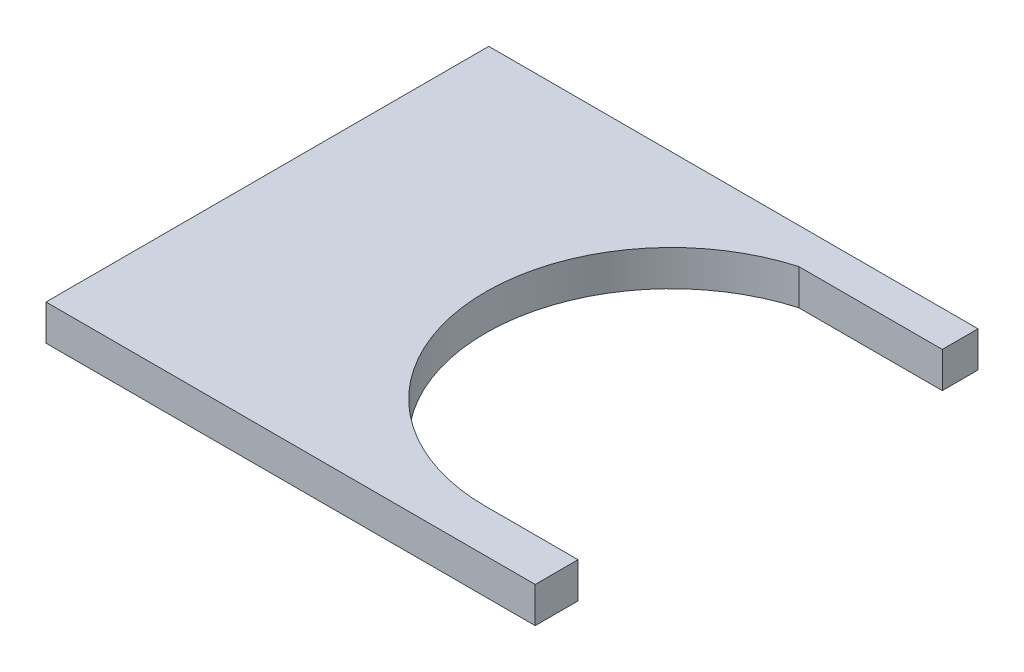
ISO-10303-21;
HEADER;
FILE_DESCRIPTION(('STEP AP214'),'2;1');
FILE_NAME('part.step','',(''),(''),'','','');
FILE_SCHEMA(('AUTOMOTIVE_DESIGN { 1 0 10303 214 1 1 1 1 }'));
ENDSEC;
DATA;
#1=APPLICATION_CONTEXT('core data for automotive mechanical design processes');
#2=APPLICATION_PROTOCOL_DEFINITION('international standard','automotive_design',2000,#1);
#3=PRODUCT_CONTEXT('',#1,'mechanical');
#4=PRODUCT('Part','Part','',(#3));
#5=PRODUCT_RELATED_PRODUCT_CATEGORY('part','',(#4));
#6=PRODUCT_DEFINITION_FORMATION('','',#4);
#7=PRODUCT_DEFINITION_CONTEXT('part definition',#1,'design');
#8=PRODUCT_DEFINITION('design','',#6,#7);
#9=PRODUCT_DEFINITION_SHAPE('','',#8);
#10=(LENGTH_UNIT() NAMED_UNIT(*) SI_UNIT(.MILLI.,.METRE.));
#11=(NAMED_UNIT(*) PLANE_ANGLE_UNIT() SI_UNIT($,.RADIAN.));
#12=(NAMED_UNIT(*) SI_UNIT($,.STERADIAN.) SOLID_ANGLE_UNIT());
#13=UNCERTAINTY_MEASURE_WITH_UNIT(LENGTH_MEASURE(1.E-05),#10,'distance_accuracy_value','');
#14=(GEOMETRIC_REPRESENTATION_CONTEXT(3) GLOBAL_UNCERTAINTY_ASSIGNED_CONTEXT((#13)) GLOBAL_UNIT_ASSIGNED_CONTEXT((#10,
#11,#12)) REPRESENTATION_CONTEXT('',''));
#15=CARTESIAN_POINT('',(0.,0.,0.));
#16=DIRECTION('',(0.,0.,1.));
#17=DIRECTION('',(1.,0.,0.));
#18=AXIS2_PLACEMENT_3D('',#15,#16,#17);
#19=CARTESIAN_POINT('',(111.1,10.,-64.));
#20=DIRECTION('',(0.,-1.,0.));
#21=DIRECTION('',(0.,0.,-1.));
#22=AXIS2_PLACEMENT_3D('',#19,#20,#21);
#23=CYLINDRICAL_SURFACE('',#22,52.);
#24=CARTESIAN_POINT('',(111.1,0.,-64.));
#25=DIRECTION('',(0.,-1.,0.));
#26=DIRECTION('',(0.,0.,1.));
#27=AXIS2_PLACEMENT_3D('',#24,#25,#26);
#28=CIRCLE('',#27,52.);
#29=CARTESIAN_POINT('',(111.1,0.,-12.));
#30=VERTEX_POINT('',#29);
#31=CARTESIAN_POINT('',(96.8171431429143,0.,-114.));
#32=VERTEX_POINT('',#31);
#33=EDGE_CURVE('E55',#30,#32,#28,.T.);
#34=ORIENTED_EDGE('',*,*,#33,.T.);
#35=DIRECTION('',(0.,1.,0.));
#36=VECTOR('',#35,1.);
#37=CARTESIAN_POINT('',(96.8171431429143,-41.4084772141773,-114.));
#38=LINE('',#37,#36);
#39=CARTESIAN_POINT('',(96.8171431429143,10.,-114.));
#40=VERTEX_POINT('',#39);
#41=EDGE_CURVE('E50',#32,#40,#38,.T.);
#42=ORIENTED_EDGE('',*,*,#41,.T.);
#43=CARTESIAN_POINT('',(111.1,10.,-64.));
#44=DIRECTION('',(0.,-1.,0.));
#45=DIRECTION('',(0.,0.,1.));
#46=AXIS2_PLACEMENT_3D('',#43,#44,#45);
#47=CIRCLE('',#46,52.);
#48=CARTESIAN_POINT('',(111.1,10.,-12.));
#49=VERTEX_POINT('',#48);
#50=EDGE_CURVE('E109',#49,#40,#47,.T.);
#51=ORIENTED_EDGE('',*,*,#50,.F.);
#52=DIRECTION('',(0.,-1.,0.));
#53=VECTOR('',#52,1.);
#54=CARTESIAN_POINT('',(111.1,10.,-12.));
#55=LINE('',#54,#53);
#56=EDGE_CURVE('E134',#49,#30,#55,.T.);
#57=ORIENTED_EDGE('',*,*,#56,.T.);
#58=EDGE_LOOP('',(#34,#42,#51,#57));
#59=FACE_BOUND('',#58,.T.);
#60=ADVANCED_FACE('F36',(#59),#23,.F.);
#61=CARTESIAN_POINT('',(137.,10.,-116.));
#62=DIRECTION('',(-1.,0.,0.));
#63=DIRECTION('',(0.,0.,1.));
#64=AXIS2_PLACEMENT_3D('',#61,#62,#63);
#65=PLANE('',#64);
#66=DIRECTION('',(0.,0.,-1.));
#67=VECTOR('',#66,1.);
#68=CARTESIAN_POINT('',(137.,0.,-116.));
#69=LINE('',#68,#67);
#70=CARTESIAN_POINT('',(137.,0.,-114.));
#71=VERTEX_POINT('',#70);
#72=CARTESIAN_POINT('',(137.,0.,-124.));
#73=VERTEX_POINT('',#72);
#74=EDGE_CURVE('E136',#71,#73,#69,.T.);
#75=ORIENTED_EDGE('',*,*,#74,.T.);
#76=DIRECTION('',(0.,-1.,0.));
#77=VECTOR('',#76,1.);
#78=CARTESIAN_POINT('',(137.,10.,-124.));
#79=LINE('',#78,#77);
#80=CARTESIAN_POINT('',(137.,10.,-124.));
#81=VERTEX_POINT('',#80);
#82=EDGE_CURVE('E11',#81,#73,#79,.T.);
#83=ORIENTED_EDGE('',*,*,#82,.F.);
#84=DIRECTION('',(0.,0.,-1.));
#85=VECTOR('',#84,1.);
#86=CARTESIAN_POINT('',(137.,10.,-116.));
#87=LINE('',#86,#85);
#88=CARTESIAN_POINT('',(137.,10.,-114.));
#89=VERTEX_POINT('',#88);
#90=EDGE_CURVE('E101',#89,#81,#87,.T.);
#91=ORIENTED_EDGE('',*,*,#90,.F.);
#92=DIRECTION('',(0.,1.,0.));
#93=VECTOR('',#92,1.);
#94=CARTESIAN_POINT('',(137.,-41.4084772141773,-114.));
#95=LINE('',#94,#93);
#96=EDGE_CURVE('E104',#71,#89,#95,.T.);
#97=ORIENTED_EDGE('',*,*,#96,.F.);
#98=EDGE_LOOP('',(#75,#83,#91,#97));
#99=FACE_BOUND('',#98,.T.);
#100=ADVANCED_FACE('F103',(#99),#65,.F.);
#101=CARTESIAN_POINT('',(137.,10.,-124.));
#102=DIRECTION('',(0.,0.,1.));
#103=DIRECTION('',(1.,0.,0.));
#104=AXIS2_PLACEMENT_3D('',#101,#102,#103);
#105=PLANE('',#104);
#106=DIRECTION('',(0.,-1.,0.));
#107=VECTOR('',#106,1.);
#108=CARTESIAN_POINT('',(0.,10.,-124.));
#109=LINE('',#108,#107);
#110=CARTESIAN_POINT('',(0.,10.,-124.));
#111=VERTEX_POINT('',#110);
#112=CARTESIAN_POINT('',(0.,0.,-124.));
#113=VERTEX_POINT('',#112);
#114=EDGE_CURVE('E43',#111,#113,#109,.T.);
#115=ORIENTED_EDGE('',*,*,#114,.F.);
#116=DIRECTION('',(-1.,0.,0.));
#117=VECTOR('',#116,1.);
#118=CARTESIAN_POINT('',(137.,10.,-124.));
#119=LINE('',#118,#117);
#120=EDGE_CURVE('E108',#81,#111,#119,.T.);
#121=ORIENTED_EDGE('',*,*,#120,.F.);
#122=ORIENTED_EDGE('',*,*,#82,.T.);
#123=DIRECTION('',(-1.,0.,0.));
#124=VECTOR('',#123,1.);
#125=CARTESIAN_POINT('',(137.,0.,-124.));
#126=LINE('',#125,#124);
#127=EDGE_CURVE('E138',#73,#113,#126,.T.);
#128=ORIENTED_EDGE('',*,*,#127,.T.);
#129=EDGE_LOOP('',(#115,#121,#122,#128));
#130=FACE_BOUND('',#129,.T.);
#131=ADVANCED_FACE('F180',(#130),#105,.F.);
#132=CARTESIAN_POINT('',(0.,10.,-124.));
#133=DIRECTION('',(1.,0.,0.));
#134=DIRECTION('',(0.,0.,-1.));
#135=AXIS2_PLACEMENT_3D('',#132,#133,#134);
#136=PLANE('',#135);
#137=DIRECTION('',(0.,0.,1.));
#138=VECTOR('',#137,1.);
#139=CARTESIAN_POINT('',(0.,0.,-124.));
#140=LINE('',#139,#138);
#141=CARTESIAN_POINT('',(0.,0.,0.));
#142=VERTEX_POINT('',#141);
#143=EDGE_CURVE('E140',#113,#142,#140,.T.);
#144=ORIENTED_EDGE('',*,*,#143,.T.);
#145=DIRECTION('',(0.,-1.,0.));
#146=VECTOR('',#145,1.);
#147=CARTESIAN_POINT('',(0.,10.,0.));
#148=LINE('',#147,#146);
#149=CARTESIAN_POINT('',(0.,10.,0.));
#150=VERTEX_POINT('',#149);
#151=EDGE_CURVE('E154',#150,#142,#148,.T.);
#152=ORIENTED_EDGE('',*,*,#151,.F.);
#153=DIRECTION('',(0.,0.,1.));
#154=VECTOR('',#153,1.);
#155=CARTESIAN_POINT('',(0.,10.,-124.));
#156=LINE('',#155,#154);
#157=EDGE_CURVE('E126',#111,#150,#156,.T.);
#158=ORIENTED_EDGE('',*,*,#157,.F.);
#159=ORIENTED_EDGE('',*,*,#114,.T.);
#160=EDGE_LOOP('',(#144,#152,#158,#159));
#161=FACE_BOUND('',#160,.T.);
#162=ADVANCED_FACE('F161',(#161),#136,.F.);
#163=CARTESIAN_POINT('',(0.,10.,0.));
#164=DIRECTION('',(0.,0.,-1.));
#165=DIRECTION('',(-1.,0.,0.));
#166=AXIS2_PLACEMENT_3D('',#163,#164,#165);
#167=PLANE('',#166);
#168=DIRECTION('',(1.,0.,0.));
#169=VECTOR('',#168,1.);
#170=CARTESIAN_POINT('',(0.,0.,0.));
#171=LINE('',#170,#169);
#172=CARTESIAN_POINT('',(137.,0.,0.));
#173=VERTEX_POINT('',#172);
#174=EDGE_CURVE('E142',#142,#173,#171,.T.);
#175=ORIENTED_EDGE('',*,*,#174,.T.);
#176=DIRECTION('',(0.,-1.,0.));
#177=VECTOR('',#176,1.);
#178=CARTESIAN_POINT('',(137.,10.,0.));
#179=LINE('',#178,#177);
#180=CARTESIAN_POINT('',(137.,10.,0.));
#181=VERTEX_POINT('',#180);
#182=EDGE_CURVE('E151',#181,#173,#179,.T.);
#183=ORIENTED_EDGE('',*,*,#182,.F.);
#184=DIRECTION('',(1.,0.,0.));
#185=VECTOR('',#184,1.);
#186=CARTESIAN_POINT('',(0.,10.,0.));
#187=LINE('',#186,#185);
#188=EDGE_CURVE('E128',#150,#181,#187,.T.);
#189=ORIENTED_EDGE('',*,*,#188,.F.);
#190=ORIENTED_EDGE('',*,*,#151,.T.);
#191=EDGE_LOOP('',(#175,#183,#189,#190));
#192=FACE_BOUND('',#191,.T.);
#193=ADVANCED_FACE('F172',(#192),#167,.F.);
#194=CARTESIAN_POINT('',(137.,10.,-12.));
#195=DIRECTION('',(-1.,0.,0.));
#196=DIRECTION('',(0.,0.,1.));
#197=AXIS2_PLACEMENT_3D('',#194,#195,#196);
#198=PLANE('',#197);
#199=DIRECTION('',(0.,0.,-1.));
#200=VECTOR('',#199,1.);
#201=CARTESIAN_POINT('',(137.,0.,-12.));
#202=LINE('',#201,#200);
#203=CARTESIAN_POINT('',(137.,0.,-12.));
#204=VERTEX_POINT('',#203);
#205=EDGE_CURVE('E144',#173,#204,#202,.T.);
#206=ORIENTED_EDGE('',*,*,#205,.T.);
#207=DIRECTION('',(0.,-1.,0.));
#208=VECTOR('',#207,1.);
#209=CARTESIAN_POINT('',(137.,10.,-12.));
#210=LINE('',#209,#208);
#211=CARTESIAN_POINT('',(137.,10.,-12.));
#212=VERTEX_POINT('',#211);
#213=EDGE_CURVE('E148',#212,#204,#210,.T.);
#214=ORIENTED_EDGE('',*,*,#213,.F.);
#215=DIRECTION('',(0.,0.,-1.));
#216=VECTOR('',#215,1.);
#217=CARTESIAN_POINT('',(137.,10.,-12.));
#218=LINE('',#217,#216);
#219=EDGE_CURVE('E130',#181,#212,#218,.T.);
#220=ORIENTED_EDGE('',*,*,#219,.F.);
#221=ORIENTED_EDGE('',*,*,#182,.T.);
#222=EDGE_LOOP('',(#206,#214,#220,#221));
#223=FACE_BOUND('',#222,.T.);
#224=ADVANCED_FACE('F176',(#223),#198,.F.);
#225=CARTESIAN_POINT('',(111.1,10.,-12.));
#226=DIRECTION('',(0.,0.,1.));
#227=DIRECTION('',(1.,0.,0.));
#228=AXIS2_PLACEMENT_3D('',#225,#226,#227);
#229=PLANE('',#228);
#230=DIRECTION('',(-1.,0.,0.));
#231=VECTOR('',#230,1.);
#232=CARTESIAN_POINT('',(111.1,0.,-12.));
#233=LINE('',#232,#231);
#234=EDGE_CURVE('E123',#204,#30,#233,.T.);
#235=ORIENTED_EDGE('',*,*,#234,.T.);
#236=ORIENTED_EDGE('',*,*,#56,.F.);
#237=DIRECTION('',(-1.,0.,0.));
#238=VECTOR('',#237,1.);
#239=CARTESIAN_POINT('',(111.1,10.,-12.));
#240=LINE('',#239,#238);
#241=EDGE_CURVE('E132',#212,#49,#240,.T.);
#242=ORIENTED_EDGE('',*,*,#241,.F.);
#243=ORIENTED_EDGE('',*,*,#213,.T.);
#244=EDGE_LOOP('',(#235,#236,#242,#243));
#245=FACE_BOUND('',#244,.T.);
#246=ADVANCED_FACE('F212',(#245),#229,.F.);
#247=CARTESIAN_POINT('',(111.1,10.,-64.));
#248=DIRECTION('',(0.,1.,0.));
#249=DIRECTION('',(0.,0.,1.));
#250=AXIS2_PLACEMENT_3D('',#247,#248,#249);
#251=PLANE('',#250);
#252=ORIENTED_EDGE('',*,*,#50,.T.);
#253=DIRECTION('',(1.,0.,0.));
#254=VECTOR('',#253,1.);
#255=CARTESIAN_POINT('',(137.,10.,-114.));
#256=LINE('',#255,#254);
#257=EDGE_CURVE('E115',#40,#89,#256,.T.);
#258=ORIENTED_EDGE('',*,*,#257,.T.);
#259=ORIENTED_EDGE('',*,*,#90,.T.);
#260=ORIENTED_EDGE('',*,*,#120,.T.);
#261=ORIENTED_EDGE('',*,*,#157,.T.);
#262=ORIENTED_EDGE('',*,*,#188,.T.);
#263=ORIENTED_EDGE('',*,*,#219,.T.);
#264=ORIENTED_EDGE('',*,*,#241,.T.);
#265=EDGE_LOOP('',(#252,#258,#259,#260,#261,#262,#263,#264));
#266=FACE_BOUND('',#265,.T.);
#267=ADVANCED_FACE('F118',(#266),#251,.T.);
#268=CARTESIAN_POINT('',(111.1,0.,-64.));
#269=DIRECTION('',(0.,1.,0.));
#270=DIRECTION('',(0.,0.,1.));
#271=AXIS2_PLACEMENT_3D('',#268,#269,#270);
#272=PLANE('',#271);
#273=ORIENTED_EDGE('',*,*,#143,.F.);
#274=ORIENTED_EDGE('',*,*,#127,.F.);
#275=ORIENTED_EDGE('',*,*,#74,.F.);
#276=DIRECTION('',(-1.,0.,0.));
#277=VECTOR('',#276,1.);
#278=CARTESIAN_POINT('',(137.,0.,-114.));
#279=LINE('',#278,#277);
#280=EDGE_CURVE('E116',#71,#32,#279,.T.);
#281=ORIENTED_EDGE('',*,*,#280,.T.);
#282=ORIENTED_EDGE('',*,*,#33,.F.);
#283=ORIENTED_EDGE('',*,*,#234,.F.);
#284=ORIENTED_EDGE('',*,*,#205,.F.);
#285=ORIENTED_EDGE('',*,*,#174,.F.);
#286=EDGE_LOOP('',(#273,#274,#275,#281,#282,#283,#284,#285));
#287=FACE_BOUND('',#286,.T.);
#288=ADVANCED_FACE('F167',(#287),#272,.F.);
#289=CARTESIAN_POINT('',(137.,-41.4084772141773,-114.));
#290=DIRECTION('',(0.,0.,1.));
#291=DIRECTION('',(1.,0.,0.));
#292=AXIS2_PLACEMENT_3D('',#289,#290,#291);
#293=PLANE('',#292);
#294=ORIENTED_EDGE('',*,*,#280,.F.);
#295=ORIENTED_EDGE('',*,*,#96,.T.);
#296=ORIENTED_EDGE('',*,*,#257,.F.);
#297=ORIENTED_EDGE('',*,*,#41,.F.);
#298=EDGE_LOOP('',(#294,#295,#296,#297));
#299=FACE_BOUND('',#298,.T.);
#300=ADVANCED_FACE('F114',(#299),#293,.T.);
#301=CLOSED_SHELL('',(#60,#100,#131,#162,#193,#224,#246,#267,#288,#300));
#302=MANIFOLD_SOLID_BREP('B2',#301);
#303=ADVANCED_BREP_SHAPE_REPRESENTATION('',(#18,#302),#14);
#304=SHAPE_DEFINITION_REPRESENTATION(#9,#303);
ENDSEC;
END-ISO-10303-21;
